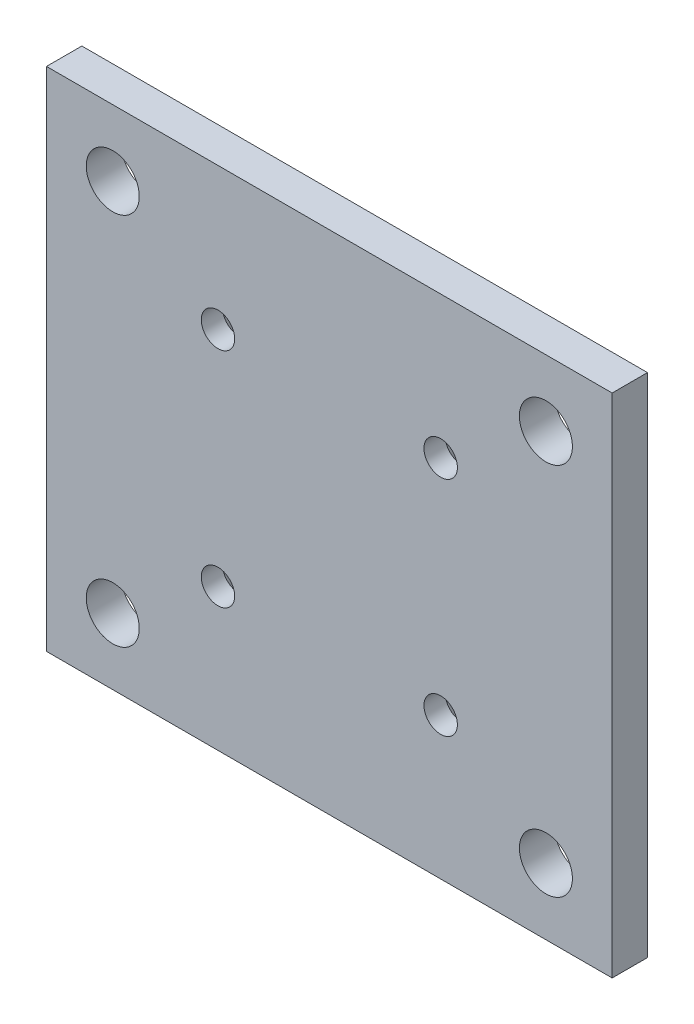
ISO-10303-21;
HEADER;
FILE_DESCRIPTION(('STEP AP214'),'2;1');
FILE_NAME('part.step','',(''),(''),'','','');
FILE_SCHEMA(('AUTOMOTIVE_DESIGN { 1 0 10303 214 1 1 1 1 }'));
ENDSEC;
DATA;
#1=APPLICATION_CONTEXT('core data for automotive mechanical design processes');
#2=APPLICATION_PROTOCOL_DEFINITION('international standard','automotive_design',2000,#1);
#3=PRODUCT_CONTEXT('',#1,'mechanical');
#4=PRODUCT('Part','Part','',(#3));
#5=PRODUCT_RELATED_PRODUCT_CATEGORY('part','',(#4));
#6=PRODUCT_DEFINITION_FORMATION('','',#4);
#7=PRODUCT_DEFINITION_CONTEXT('part definition',#1,'design');
#8=PRODUCT_DEFINITION('design','',#6,#7);
#9=PRODUCT_DEFINITION_SHAPE('','',#8);
#10=(LENGTH_UNIT() NAMED_UNIT(*) SI_UNIT(.MILLI.,.METRE.));
#11=(NAMED_UNIT(*) PLANE_ANGLE_UNIT() SI_UNIT($,.RADIAN.));
#12=(NAMED_UNIT(*) SI_UNIT($,.STERADIAN.) SOLID_ANGLE_UNIT());
#13=UNCERTAINTY_MEASURE_WITH_UNIT(LENGTH_MEASURE(1.E-05),#10,'distance_accuracy_value','');
#14=(GEOMETRIC_REPRESENTATION_CONTEXT(3) GLOBAL_UNCERTAINTY_ASSIGNED_CONTEXT((#13)) GLOBAL_UNIT_ASSIGNED_CONTEXT((#10,
#11,#12)) REPRESENTATION_CONTEXT('',''));
#15=CARTESIAN_POINT('',(0.,0.,0.));
#16=DIRECTION('',(0.,0.,1.));
#17=DIRECTION('',(1.,0.,0.));
#18=AXIS2_PLACEMENT_3D('',#15,#16,#17);
#19=CARTESIAN_POINT('',(0.,0.,-54.275));
#20=DIRECTION('',(0.,0.,1.));
#21=DIRECTION('',(0.,-1.,0.));
#22=AXIS2_PLACEMENT_3D('',#19,#20,#21);
#23=PLANE('',#22);
#24=CARTESIAN_POINT('',(10.,355.976869629706,-54.2749999999999));
#25=DIRECTION('',(0.,0.,1.));
#26=DIRECTION('',(0.,-1.,0.));
#27=AXIS2_PLACEMENT_3D('',#24,#25,#26);
#28=CIRCLE('',#27,2.76999999999999);
#29=CARTESIAN_POINT('',(10.,353.206869629706,-54.2749999999999));
#30=VERTEX_POINT('',#29);
#31=EDGE_CURVE('E125',#30,#30,#28,.T.);
#32=ORIENTED_EDGE('',*,*,#31,.T.);
#33=EDGE_LOOP('',(#32));
#34=FACE_BOUND('',#33,.T.);
#35=CARTESIAN_POINT('',(-10.0000000000001,355.976869629706,-54.2749999999999));
#36=DIRECTION('',(0.,0.,1.));
#37=DIRECTION('',(0.,-1.,0.));
#38=AXIS2_PLACEMENT_3D('',#35,#36,#37);
#39=CIRCLE('',#38,2.76999999999994);
#40=CARTESIAN_POINT('',(-10.0000000000001,353.206869629706,-54.2749999999999));
#41=VERTEX_POINT('',#40);
#42=EDGE_CURVE('E122',#41,#41,#39,.T.);
#43=ORIENTED_EDGE('',*,*,#42,.T.);
#44=EDGE_LOOP('',(#43));
#45=FACE_BOUND('',#44,.T.);
#46=CARTESIAN_POINT('',(-10.0000000000001,375.976869629706,-54.2749999999999));
#47=DIRECTION('',(0.,0.,1.));
#48=DIRECTION('',(0.,-1.,0.));
#49=AXIS2_PLACEMENT_3D('',#46,#47,#48);
#50=CIRCLE('',#49,2.76999999999999);
#51=CARTESIAN_POINT('',(-10.0000000000001,373.206869629706,-54.2749999999999));
#52=VERTEX_POINT('',#51);
#53=EDGE_CURVE('E119',#52,#52,#50,.T.);
#54=ORIENTED_EDGE('',*,*,#53,.T.);
#55=EDGE_LOOP('',(#54));
#56=FACE_BOUND('',#55,.T.);
#57=CARTESIAN_POINT('',(9.99999999999989,375.976869629706,-54.2749999999999));
#58=DIRECTION('',(0.,0.,1.));
#59=DIRECTION('',(0.,-1.,0.));
#60=AXIS2_PLACEMENT_3D('',#57,#58,#59);
#61=CIRCLE('',#60,2.76999999999999);
#62=CARTESIAN_POINT('',(9.99999999999989,373.206869629706,-54.2749999999999));
#63=VERTEX_POINT('',#62);
#64=EDGE_CURVE('E116',#63,#63,#61,.T.);
#65=ORIENTED_EDGE('',*,*,#64,.T.);
#66=EDGE_LOOP('',(#65));
#67=FACE_BOUND('',#66,.T.);
#68=DIRECTION('',(-1.,0.,0.));
#69=VECTOR('',#68,1.);
#70=CARTESIAN_POINT('',(25.3999999999998,343.226869629706,-54.2749999999999));
#71=LINE('',#70,#69);
#72=CARTESIAN_POINT('',(25.3999999999998,343.226869629706,-54.2749999999999));
#73=VERTEX_POINT('',#72);
#74=CARTESIAN_POINT('',(-25.4,343.226869629706,-54.2749999999999));
#75=VERTEX_POINT('',#74);
#76=EDGE_CURVE('E79',#73,#75,#71,.T.);
#77=ORIENTED_EDGE('',*,*,#76,.T.);
#78=DIRECTION('',(0.,1.,0.));
#79=VECTOR('',#78,1.);
#80=CARTESIAN_POINT('',(-25.4,388.726869629706,-54.2749999999999));
#81=LINE('',#80,#79);
#82=CARTESIAN_POINT('',(-25.4,388.726869629706,-54.2749999999999));
#83=VERTEX_POINT('',#82);
#84=EDGE_CURVE('E82',#75,#83,#81,.T.);
#85=ORIENTED_EDGE('',*,*,#84,.T.);
#86=DIRECTION('',(1.,0.,0.));
#87=VECTOR('',#86,1.);
#88=CARTESIAN_POINT('',(-13.5000000000001,388.726869629706,-54.2749999999999));
#89=LINE('',#88,#87);
#90=CARTESIAN_POINT('',(25.3999999999998,388.726869629706,-54.2749999999999));
#91=VERTEX_POINT('',#90);
#92=EDGE_CURVE('E86',#83,#91,#89,.T.);
#93=ORIENTED_EDGE('',*,*,#92,.T.);
#94=DIRECTION('',(0.,-1.,0.));
#95=VECTOR('',#94,1.);
#96=CARTESIAN_POINT('',(25.3999999999998,388.726869629706,-54.2749999999999));
#97=LINE('',#96,#95);
#98=EDGE_CURVE('E51',#91,#73,#97,.T.);
#99=ORIENTED_EDGE('',*,*,#98,.T.);
#100=EDGE_LOOP('',(#77,#85,#93,#99));
#101=FACE_BOUND('',#100,.T.);
#102=CARTESIAN_POINT('',(-19.45,382.776869629706,-54.2749999999999));
#103=DIRECTION('',(0.,0.,-1.));
#104=DIRECTION('',(0.,1.,0.));
#105=AXIS2_PLACEMENT_3D('',#102,#103,#104);
#106=CIRCLE('',#105,2.38125000000001);
#107=CARTESIAN_POINT('',(-19.45,385.158119629706,-54.2749999999999));
#108=VERTEX_POINT('',#107);
#109=EDGE_CURVE('E199',#108,#108,#106,.T.);
#110=ORIENTED_EDGE('',*,*,#109,.F.);
#111=EDGE_LOOP('',(#110));
#112=FACE_BOUND('',#111,.T.);
#113=CARTESIAN_POINT('',(19.4499999999998,382.776869629706,-54.2749999999999));
#114=DIRECTION('',(0.,0.,-1.));
#115=DIRECTION('',(0.,-1.,0.));
#116=AXIS2_PLACEMENT_3D('',#113,#114,#115);
#117=CIRCLE('',#116,2.38125000000002);
#118=CARTESIAN_POINT('',(19.4499999999998,380.395619629706,-54.2749999999999));
#119=VERTEX_POINT('',#118);
#120=EDGE_CURVE('E255',#119,#119,#117,.T.);
#121=ORIENTED_EDGE('',*,*,#120,.F.);
#122=EDGE_LOOP('',(#121));
#123=FACE_BOUND('',#122,.T.);
#124=CARTESIAN_POINT('',(-19.45,349.176869629706,-54.2749999999999));
#125=DIRECTION('',(0.,0.,-1.));
#126=DIRECTION('',(0.,-1.,0.));
#127=AXIS2_PLACEMENT_3D('',#124,#125,#126);
#128=CIRCLE('',#127,2.38125000000001);
#129=CARTESIAN_POINT('',(-19.45,346.795619629706,-54.2749999999999));
#130=VERTEX_POINT('',#129);
#131=EDGE_CURVE('E242',#130,#130,#128,.T.);
#132=ORIENTED_EDGE('',*,*,#131,.F.);
#133=EDGE_LOOP('',(#132));
#134=FACE_BOUND('',#133,.T.);
#135=CARTESIAN_POINT('',(19.4499999999998,349.176869629706,-54.2749999999999));
#136=DIRECTION('',(0.,0.,-1.));
#137=DIRECTION('',(0.,1.,0.));
#138=AXIS2_PLACEMENT_3D('',#135,#136,#137);
#139=CIRCLE('',#138,2.38125000000002);
#140=CARTESIAN_POINT('',(19.4499999999998,351.558119629706,-54.2749999999999));
#141=VERTEX_POINT('',#140);
#142=EDGE_CURVE('E246',#141,#141,#139,.T.);
#143=ORIENTED_EDGE('',*,*,#142,.F.);
#144=EDGE_LOOP('',(#143));
#145=FACE_BOUND('',#144,.T.);
#146=ADVANCED_FACE('F34',(#34,#45,#56,#67,#101,#112,#123,#134,#145),#23,.F.);
#147=CARTESIAN_POINT('',(0.,0.,-51.1));
#148=DIRECTION('',(0.,0.,1.));
#149=DIRECTION('',(0.,-1.,0.));
#150=AXIS2_PLACEMENT_3D('',#147,#148,#149);
#151=PLANE('',#150);
#152=CARTESIAN_POINT('',(-19.45,349.176869629706,-51.1));
#153=DIRECTION('',(0.,0.,-1.));
#154=DIRECTION('',(0.,-1.,0.));
#155=AXIS2_PLACEMENT_3D('',#152,#153,#154);
#156=CIRCLE('',#155,2.38125000000001);
#157=CARTESIAN_POINT('',(-19.45,346.795619629706,-51.1));
#158=VERTEX_POINT('',#157);
#159=EDGE_CURVE('E245',#158,#158,#156,.T.);
#160=ORIENTED_EDGE('',*,*,#159,.T.);
#161=EDGE_LOOP('',(#160));
#162=FACE_BOUND('',#161,.T.);
#163=CARTESIAN_POINT('',(-19.45,382.776869629706,-51.0999999999999));
#164=DIRECTION('',(0.,0.,-1.));
#165=DIRECTION('',(0.,1.,0.));
#166=AXIS2_PLACEMENT_3D('',#163,#164,#165);
#167=CIRCLE('',#166,2.38125000000001);
#168=CARTESIAN_POINT('',(-19.45,385.158119629706,-51.0999999999999));
#169=VERTEX_POINT('',#168);
#170=EDGE_CURVE('E205',#169,#169,#167,.T.);
#171=ORIENTED_EDGE('',*,*,#170,.T.);
#172=EDGE_LOOP('',(#171));
#173=FACE_BOUND('',#172,.T.);
#174=CARTESIAN_POINT('',(9.99999999999989,375.976869629706,-51.0999999999999));
#175=DIRECTION('',(0.,0.,-1.));
#176=DIRECTION('',(0.,1.,0.));
#177=AXIS2_PLACEMENT_3D('',#174,#175,#176);
#178=CIRCLE('',#177,1.5);
#179=CARTESIAN_POINT('',(9.99999999999989,377.476869629706,-51.0999999999999));
#180=VERTEX_POINT('',#179);
#181=EDGE_CURVE('E198',#180,#180,#178,.T.);
#182=ORIENTED_EDGE('',*,*,#181,.T.);
#183=EDGE_LOOP('',(#182));
#184=FACE_BOUND('',#183,.T.);
#185=CARTESIAN_POINT('',(-10.0000000000001,355.976869629706,-51.0999999999999));
#186=DIRECTION('',(0.,0.,-1.));
#187=DIRECTION('',(0.,1.,0.));
#188=AXIS2_PLACEMENT_3D('',#185,#186,#187);
#189=CIRCLE('',#188,1.49999999999992);
#190=CARTESIAN_POINT('',(-10.0000000000001,357.476869629706,-51.0999999999999));
#191=VERTEX_POINT('',#190);
#192=EDGE_CURVE('E104',#191,#191,#189,.T.);
#193=ORIENTED_EDGE('',*,*,#192,.T.);
#194=EDGE_LOOP('',(#193));
#195=FACE_BOUND('',#194,.T.);
#196=DIRECTION('',(-1.,0.,0.));
#197=VECTOR('',#196,1.);
#198=CARTESIAN_POINT('',(-25.4,343.226869629706,-51.1));
#199=LINE('',#198,#197);
#200=CARTESIAN_POINT('',(25.3999999999998,343.226869629706,-51.1));
#201=VERTEX_POINT('',#200);
#202=CARTESIAN_POINT('',(-25.4,343.226869629706,-51.1));
#203=VERTEX_POINT('',#202);
#204=EDGE_CURVE('E74',#201,#203,#199,.T.);
#205=ORIENTED_EDGE('',*,*,#204,.F.);
#206=DIRECTION('',(0.,-1.,0.));
#207=VECTOR('',#206,1.);
#208=CARTESIAN_POINT('',(25.3999999999998,388.726869629706,-51.0999999999999));
#209=LINE('',#208,#207);
#210=CARTESIAN_POINT('',(25.3999999999998,388.726869629706,-51.0999999999999));
#211=VERTEX_POINT('',#210);
#212=EDGE_CURVE('E107',#211,#201,#209,.T.);
#213=ORIENTED_EDGE('',*,*,#212,.F.);
#214=DIRECTION('',(1.,0.,0.));
#215=VECTOR('',#214,1.);
#216=CARTESIAN_POINT('',(13.4999999999999,388.726869629706,-51.0999999999999));
#217=LINE('',#216,#215);
#218=CARTESIAN_POINT('',(-25.4,388.726869629706,-51.0999999999999));
#219=VERTEX_POINT('',#218);
#220=EDGE_CURVE('E67',#219,#211,#217,.T.);
#221=ORIENTED_EDGE('',*,*,#220,.F.);
#222=DIRECTION('',(0.,1.,0.));
#223=VECTOR('',#222,1.);
#224=CARTESIAN_POINT('',(-25.4,388.726869629706,-51.0999999999999));
#225=LINE('',#224,#223);
#226=EDGE_CURVE('E93',#203,#219,#225,.T.);
#227=ORIENTED_EDGE('',*,*,#226,.F.);
#228=EDGE_LOOP('',(#205,#213,#221,#227));
#229=FACE_BOUND('',#228,.T.);
#230=CARTESIAN_POINT('',(-10.0000000000001,375.976869629706,-51.0999999999999));
#231=DIRECTION('',(0.,0.,-1.));
#232=DIRECTION('',(0.,1.,0.));
#233=AXIS2_PLACEMENT_3D('',#230,#231,#232);
#234=CIRCLE('',#233,1.5);
#235=CARTESIAN_POINT('',(-10.0000000000001,377.476869629706,-51.0999999999999));
#236=VERTEX_POINT('',#235);
#237=EDGE_CURVE('E202',#236,#236,#234,.T.);
#238=ORIENTED_EDGE('',*,*,#237,.T.);
#239=EDGE_LOOP('',(#238));
#240=FACE_BOUND('',#239,.T.);
#241=CARTESIAN_POINT('',(10.,355.976869629706,-51.0999999999999));
#242=DIRECTION('',(0.,0.,-1.));
#243=DIRECTION('',(0.,1.,0.));
#244=AXIS2_PLACEMENT_3D('',#241,#242,#243);
#245=CIRCLE('',#244,1.5);
#246=CARTESIAN_POINT('',(10.,357.476869629706,-51.0999999999999));
#247=VERTEX_POINT('',#246);
#248=EDGE_CURVE('E196',#247,#247,#245,.T.);
#249=ORIENTED_EDGE('',*,*,#248,.T.);
#250=EDGE_LOOP('',(#249));
#251=FACE_BOUND('',#250,.T.);
#252=CARTESIAN_POINT('',(19.4499999999998,382.776869629706,-51.0999999999999));
#253=DIRECTION('',(0.,0.,-1.));
#254=DIRECTION('',(0.,-1.,0.));
#255=AXIS2_PLACEMENT_3D('',#252,#253,#254);
#256=CIRCLE('',#255,2.38125000000002);
#257=CARTESIAN_POINT('',(19.4499999999998,380.395619629706,-51.0999999999999));
#258=VERTEX_POINT('',#257);
#259=EDGE_CURVE('E248',#258,#258,#256,.T.);
#260=ORIENTED_EDGE('',*,*,#259,.T.);
#261=EDGE_LOOP('',(#260));
#262=FACE_BOUND('',#261,.T.);
#263=CARTESIAN_POINT('',(19.4499999999998,349.176869629706,-51.1));
#264=DIRECTION('',(0.,0.,-1.));
#265=DIRECTION('',(0.,1.,0.));
#266=AXIS2_PLACEMENT_3D('',#263,#264,#265);
#267=CIRCLE('',#266,2.38125000000002);
#268=CARTESIAN_POINT('',(19.4499999999998,351.558119629706,-51.1));
#269=VERTEX_POINT('',#268);
#270=EDGE_CURVE('E251',#269,#269,#267,.T.);
#271=ORIENTED_EDGE('',*,*,#270,.T.);
#272=EDGE_LOOP('',(#271));
#273=FACE_BOUND('',#272,.T.);
#274=ADVANCED_FACE('F150',(#162,#173,#184,#195,#229,#240,#251,#262,#273),#151,.T.);
#275=CARTESIAN_POINT('',(-25.4,343.226869629706,-54.2749999999999));
#276=DIRECTION('',(0.,1.,0.));
#277=DIRECTION('',(0.,0.,1.));
#278=AXIS2_PLACEMENT_3D('',#275,#276,#277);
#279=PLANE('',#278);
#280=ORIENTED_EDGE('',*,*,#204,.T.);
#281=DIRECTION('',(0.,0.,1.));
#282=VECTOR('',#281,1.);
#283=CARTESIAN_POINT('',(-25.4,343.226869629706,-54.2749999999999));
#284=LINE('',#283,#282);
#285=EDGE_CURVE('E94',#75,#203,#284,.T.);
#286=ORIENTED_EDGE('',*,*,#285,.F.);
#287=ORIENTED_EDGE('',*,*,#76,.F.);
#288=DIRECTION('',(0.,0.,1.));
#289=VECTOR('',#288,1.);
#290=CARTESIAN_POINT('',(25.3999999999998,343.226869629706,-54.2749999999999));
#291=LINE('',#290,#289);
#292=EDGE_CURVE('E99',#73,#201,#291,.T.);
#293=ORIENTED_EDGE('',*,*,#292,.T.);
#294=EDGE_LOOP('',(#280,#286,#287,#293));
#295=FACE_BOUND('',#294,.T.);
#296=ADVANCED_FACE('F156',(#295),#279,.F.);
#297=CARTESIAN_POINT('',(-25.4,388.726869629706,-54.2749999999999));
#298=DIRECTION('',(1.,0.,0.));
#299=DIRECTION('',(0.,1.,0.));
#300=AXIS2_PLACEMENT_3D('',#297,#298,#299);
#301=PLANE('',#300);
#302=ORIENTED_EDGE('',*,*,#226,.T.);
#303=DIRECTION('',(0.,0.,1.));
#304=VECTOR('',#303,1.);
#305=CARTESIAN_POINT('',(-25.4,388.726869629706,-54.2749999999999));
#306=LINE('',#305,#304);
#307=EDGE_CURVE('E91',#83,#219,#306,.T.);
#308=ORIENTED_EDGE('',*,*,#307,.F.);
#309=ORIENTED_EDGE('',*,*,#84,.F.);
#310=ORIENTED_EDGE('',*,*,#285,.T.);
#311=EDGE_LOOP('',(#302,#308,#309,#310));
#312=FACE_BOUND('',#311,.T.);
#313=ADVANCED_FACE('F92',(#312),#301,.F.);
#314=CARTESIAN_POINT('',(13.4999999999999,388.726869629706,-54.2749999999999));
#315=DIRECTION('',(0.,-1.,0.));
#316=DIRECTION('',(0.,0.,-1.));
#317=AXIS2_PLACEMENT_3D('',#314,#315,#316);
#318=PLANE('',#317);
#319=ORIENTED_EDGE('',*,*,#220,.T.);
#320=DIRECTION('',(0.,0.,1.));
#321=VECTOR('',#320,1.);
#322=CARTESIAN_POINT('',(25.3999999999998,388.726869629706,-54.2749999999999));
#323=LINE('',#322,#321);
#324=EDGE_CURVE('E95',#91,#211,#323,.T.);
#325=ORIENTED_EDGE('',*,*,#324,.F.);
#326=ORIENTED_EDGE('',*,*,#92,.F.);
#327=ORIENTED_EDGE('',*,*,#307,.T.);
#328=EDGE_LOOP('',(#319,#325,#326,#327));
#329=FACE_BOUND('',#328,.T.);
#330=ADVANCED_FACE('F97',(#329),#318,.F.);
#331=CARTESIAN_POINT('',(25.3999999999998,388.726869629706,-54.2749999999999));
#332=DIRECTION('',(-1.,0.,0.));
#333=DIRECTION('',(0.,-1.,0.));
#334=AXIS2_PLACEMENT_3D('',#331,#332,#333);
#335=PLANE('',#334);
#336=ORIENTED_EDGE('',*,*,#212,.T.);
#337=ORIENTED_EDGE('',*,*,#292,.F.);
#338=ORIENTED_EDGE('',*,*,#98,.F.);
#339=ORIENTED_EDGE('',*,*,#324,.T.);
#340=EDGE_LOOP('',(#336,#337,#338,#339));
#341=FACE_BOUND('',#340,.T.);
#342=ADVANCED_FACE('F164',(#341),#335,.F.);
#343=CARTESIAN_POINT('',(-10.0000000000001,355.976869629706,-54.2749999999999));
#344=DIRECTION('',(0.,0.,1.));
#345=DIRECTION('',(0.,-1.,0.));
#346=AXIS2_PLACEMENT_3D('',#343,#344,#345);
#347=CYLINDRICAL_SURFACE('',#346,1.49999999999992);
#348=CARTESIAN_POINT('',(-10.0000000000001,355.976869629706,-53.0049999999999));
#349=DIRECTION('',(0.,0.,1.));
#350=DIRECTION('',(1.,0.,0.));
#351=AXIS2_PLACEMENT_3D('',#348,#349,#350);
#352=CIRCLE('',#351,1.49999999999992);
#353=CARTESIAN_POINT('',(-8.50000000000019,355.976869629706,-53.0049999999999));
#354=VERTEX_POINT('',#353);
#355=EDGE_CURVE('E128',#354,#354,#352,.F.);
#356=ORIENTED_EDGE('',*,*,#355,.T.);
#357=EDGE_LOOP('',(#356));
#358=FACE_BOUND('',#357,.T.);
#359=ORIENTED_EDGE('',*,*,#192,.F.);
#360=EDGE_LOOP('',(#359));
#361=FACE_BOUND('',#360,.T.);
#362=ADVANCED_FACE('F161',(#358,#361),#347,.F.);
#363=CARTESIAN_POINT('',(-10.0000000000001,375.976869629706,-54.2749999999999));
#364=DIRECTION('',(0.,0.,1.));
#365=DIRECTION('',(0.,-1.,0.));
#366=AXIS2_PLACEMENT_3D('',#363,#364,#365);
#367=CYLINDRICAL_SURFACE('',#366,1.5);
#368=CARTESIAN_POINT('',(-10.0000000000001,375.976869629706,-53.0049999999999));
#369=DIRECTION('',(0.,0.,1.));
#370=DIRECTION('',(1.,0.,0.));
#371=AXIS2_PLACEMENT_3D('',#368,#369,#370);
#372=CIRCLE('',#371,1.5);
#373=CARTESIAN_POINT('',(-8.50000000000015,375.976869629706,-53.0049999999999));
#374=VERTEX_POINT('',#373);
#375=EDGE_CURVE('E43',#374,#374,#372,.F.);
#376=ORIENTED_EDGE('',*,*,#375,.T.);
#377=EDGE_LOOP('',(#376));
#378=FACE_BOUND('',#377,.T.);
#379=ORIENTED_EDGE('',*,*,#237,.F.);
#380=EDGE_LOOP('',(#379));
#381=FACE_BOUND('',#380,.T.);
#382=ADVANCED_FACE('F133',(#378,#381),#367,.F.);
#383=CARTESIAN_POINT('',(9.99999999999989,375.976869629706,-54.2749999999999));
#384=DIRECTION('',(0.,0.,1.));
#385=DIRECTION('',(0.,-1.,0.));
#386=AXIS2_PLACEMENT_3D('',#383,#384,#385);
#387=CYLINDRICAL_SURFACE('',#386,1.5);
#388=CARTESIAN_POINT('',(9.99999999999989,375.976869629706,-53.0049999999999));
#389=DIRECTION('',(0.,0.,1.));
#390=DIRECTION('',(1.,0.,0.));
#391=AXIS2_PLACEMENT_3D('',#388,#389,#390);
#392=CIRCLE('',#391,1.5);
#393=CARTESIAN_POINT('',(11.4999999999999,375.976869629706,-53.0049999999999));
#394=VERTEX_POINT('',#393);
#395=EDGE_CURVE('E11',#394,#394,#392,.F.);
#396=ORIENTED_EDGE('',*,*,#395,.T.);
#397=EDGE_LOOP('',(#396));
#398=FACE_BOUND('',#397,.T.);
#399=ORIENTED_EDGE('',*,*,#181,.F.);
#400=EDGE_LOOP('',(#399));
#401=FACE_BOUND('',#400,.T.);
#402=ADVANCED_FACE('F192',(#398,#401),#387,.F.);
#403=CARTESIAN_POINT('',(10.,355.976869629706,-54.2749999999999));
#404=DIRECTION('',(0.,0.,1.));
#405=DIRECTION('',(0.,-1.,0.));
#406=AXIS2_PLACEMENT_3D('',#403,#404,#405);
#407=CYLINDRICAL_SURFACE('',#406,1.5);
#408=CARTESIAN_POINT('',(10.,355.976869629706,-53.0049999999999));
#409=DIRECTION('',(0.,0.,1.));
#410=DIRECTION('',(1.,0.,0.));
#411=AXIS2_PLACEMENT_3D('',#408,#409,#410);
#412=CIRCLE('',#411,1.5);
#413=CARTESIAN_POINT('',(11.5,355.976869629706,-53.0049999999999));
#414=VERTEX_POINT('',#413);
#415=EDGE_CURVE('E113',#414,#414,#412,.F.);
#416=ORIENTED_EDGE('',*,*,#415,.T.);
#417=EDGE_LOOP('',(#416));
#418=FACE_BOUND('',#417,.T.);
#419=ORIENTED_EDGE('',*,*,#248,.F.);
#420=EDGE_LOOP('',(#419));
#421=FACE_BOUND('',#420,.T.);
#422=ADVANCED_FACE('F188',(#418,#421),#407,.F.);
#423=CARTESIAN_POINT('',(-19.45,382.776869629706,-54.2749999999999));
#424=DIRECTION('',(0.,0.,1.));
#425=DIRECTION('',(0.,-1.,0.));
#426=AXIS2_PLACEMENT_3D('',#423,#424,#425);
#427=CYLINDRICAL_SURFACE('',#426,2.38125000000001);
#428=ORIENTED_EDGE('',*,*,#109,.T.);
#429=EDGE_LOOP('',(#428));
#430=FACE_BOUND('',#429,.T.);
#431=ORIENTED_EDGE('',*,*,#170,.F.);
#432=EDGE_LOOP('',(#431));
#433=FACE_BOUND('',#432,.T.);
#434=ADVANCED_FACE('F191',(#430,#433),#427,.F.);
#435=CARTESIAN_POINT('',(19.4499999999998,382.776869629706,-54.2749999999999));
#436=DIRECTION('',(0.,0.,1.));
#437=DIRECTION('',(0.,-1.,0.));
#438=AXIS2_PLACEMENT_3D('',#435,#436,#437);
#439=CYLINDRICAL_SURFACE('',#438,2.38125000000002);
#440=ORIENTED_EDGE('',*,*,#120,.T.);
#441=EDGE_LOOP('',(#440));
#442=FACE_BOUND('',#441,.T.);
#443=ORIENTED_EDGE('',*,*,#259,.F.);
#444=EDGE_LOOP('',(#443));
#445=FACE_BOUND('',#444,.T.);
#446=ADVANCED_FACE('F230',(#442,#445),#439,.F.);
#447=CARTESIAN_POINT('',(-19.45,349.176869629706,-54.2749999999999));
#448=DIRECTION('',(0.,0.,1.));
#449=DIRECTION('',(0.,-1.,0.));
#450=AXIS2_PLACEMENT_3D('',#447,#448,#449);
#451=CYLINDRICAL_SURFACE('',#450,2.38125000000001);
#452=ORIENTED_EDGE('',*,*,#131,.T.);
#453=EDGE_LOOP('',(#452));
#454=FACE_BOUND('',#453,.T.);
#455=ORIENTED_EDGE('',*,*,#159,.F.);
#456=EDGE_LOOP('',(#455));
#457=FACE_BOUND('',#456,.T.);
#458=ADVANCED_FACE('F181',(#454,#457),#451,.F.);
#459=CARTESIAN_POINT('',(19.4499999999998,349.176869629706,-54.2749999999999));
#460=DIRECTION('',(0.,0.,1.));
#461=DIRECTION('',(0.,-1.,0.));
#462=AXIS2_PLACEMENT_3D('',#459,#460,#461);
#463=CYLINDRICAL_SURFACE('',#462,2.38125000000002);
#464=ORIENTED_EDGE('',*,*,#142,.T.);
#465=EDGE_LOOP('',(#464));
#466=FACE_BOUND('',#465,.T.);
#467=ORIENTED_EDGE('',*,*,#270,.F.);
#468=EDGE_LOOP('',(#467));
#469=FACE_BOUND('',#468,.T.);
#470=ADVANCED_FACE('F176',(#466,#469),#463,.F.);
#471=CARTESIAN_POINT('',(10.,355.976869629706,-53.0049999999999));
#472=DIRECTION('',(0.,0.,-1.));
#473=DIRECTION('',(-1.,0.,0.));
#474=AXIS2_PLACEMENT_3D('',#471,#472,#473);
#475=CONICAL_SURFACE('',#474,1.5,0.785398163397448);
#476=ORIENTED_EDGE('',*,*,#31,.F.);
#477=EDGE_LOOP('',(#476));
#478=FACE_BOUND('',#477,.T.);
#479=ORIENTED_EDGE('',*,*,#415,.F.);
#480=EDGE_LOOP('',(#479));
#481=FACE_BOUND('',#480,.T.);
#482=ADVANCED_FACE('F145',(#478,#481),#475,.F.);
#483=CARTESIAN_POINT('',(-10.0000000000001,355.976869629706,-53.0049999999999));
#484=DIRECTION('',(0.,0.,-1.));
#485=DIRECTION('',(-1.,0.,0.));
#486=AXIS2_PLACEMENT_3D('',#483,#484,#485);
#487=CONICAL_SURFACE('',#486,1.49999999999992,0.785398163397439);
#488=ORIENTED_EDGE('',*,*,#42,.F.);
#489=EDGE_LOOP('',(#488));
#490=FACE_BOUND('',#489,.T.);
#491=ORIENTED_EDGE('',*,*,#355,.F.);
#492=EDGE_LOOP('',(#491));
#493=FACE_BOUND('',#492,.T.);
#494=ADVANCED_FACE('F138',(#490,#493),#487,.F.);
#495=CARTESIAN_POINT('',(-10.0000000000001,375.976869629706,-53.0049999999999));
#496=DIRECTION('',(0.,0.,-1.));
#497=DIRECTION('',(-1.,0.,0.));
#498=AXIS2_PLACEMENT_3D('',#495,#496,#497);
#499=CONICAL_SURFACE('',#498,1.5,0.785398163397448);
#500=ORIENTED_EDGE('',*,*,#53,.F.);
#501=EDGE_LOOP('',(#500));
#502=FACE_BOUND('',#501,.T.);
#503=ORIENTED_EDGE('',*,*,#375,.F.);
#504=EDGE_LOOP('',(#503));
#505=FACE_BOUND('',#504,.T.);
#506=ADVANCED_FACE('F136',(#502,#505),#499,.F.);
#507=CARTESIAN_POINT('',(9.99999999999989,375.976869629706,-53.0049999999999));
#508=DIRECTION('',(0.,0.,-1.));
#509=DIRECTION('',(-1.,0.,0.));
#510=AXIS2_PLACEMENT_3D('',#507,#508,#509);
#511=CONICAL_SURFACE('',#510,1.5,0.785398163397447);
#512=ORIENTED_EDGE('',*,*,#64,.F.);
#513=EDGE_LOOP('',(#512));
#514=FACE_BOUND('',#513,.T.);
#515=ORIENTED_EDGE('',*,*,#395,.F.);
#516=EDGE_LOOP('',(#515));
#517=FACE_BOUND('',#516,.T.);
#518=ADVANCED_FACE('F36',(#514,#517),#511,.F.);
#519=CLOSED_SHELL('',(#146,#274,#296,#313,#330,#342,#362,#382,#402,#422,#434,#446,#458,#470,
#482,#494,#506,#518));
#520=MANIFOLD_SOLID_BREP('B2',#519);
#521=ADVANCED_BREP_SHAPE_REPRESENTATION('',(#18,#520),#14);
#522=SHAPE_DEFINITION_REPRESENTATION(#9,#521);
ENDSEC;
END-ISO-10303-21;
